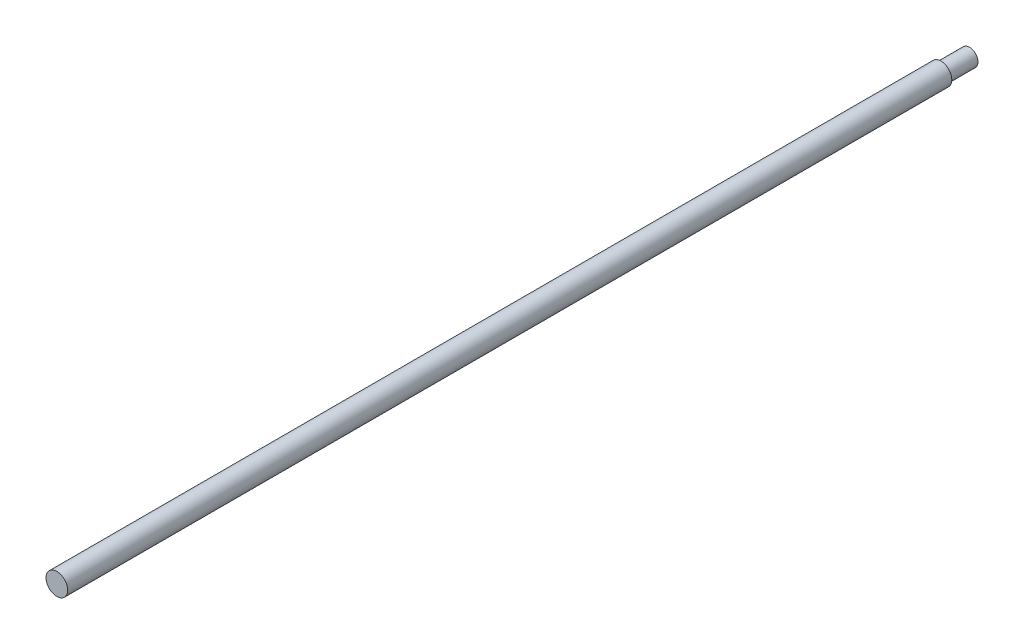
ISO-10303-21;
HEADER;
FILE_DESCRIPTION(('STEP AP214'),'2;1');
FILE_NAME('part.step','',(''),(''),'','','');
FILE_SCHEMA(('AUTOMOTIVE_DESIGN { 1 0 10303 214 1 1 1 1 }'));
ENDSEC;
DATA;
#1=APPLICATION_CONTEXT('core data for automotive mechanical design processes');
#2=APPLICATION_PROTOCOL_DEFINITION('international standard','automotive_design',2000,#1);
#3=PRODUCT_CONTEXT('',#1,'mechanical');
#4=PRODUCT('Part','Part','',(#3));
#5=PRODUCT_RELATED_PRODUCT_CATEGORY('part','',(#4));
#6=PRODUCT_DEFINITION_FORMATION('','',#4);
#7=PRODUCT_DEFINITION_CONTEXT('part definition',#1,'design');
#8=PRODUCT_DEFINITION('design','',#6,#7);
#9=PRODUCT_DEFINITION_SHAPE('','',#8);
#10=(LENGTH_UNIT() NAMED_UNIT(*) SI_UNIT(.MILLI.,.METRE.));
#11=(NAMED_UNIT(*) PLANE_ANGLE_UNIT() SI_UNIT($,.RADIAN.));
#12=(NAMED_UNIT(*) SI_UNIT($,.STERADIAN.) SOLID_ANGLE_UNIT());
#13=UNCERTAINTY_MEASURE_WITH_UNIT(LENGTH_MEASURE(1.E-05),#10,'distance_accuracy_value','');
#14=(GEOMETRIC_REPRESENTATION_CONTEXT(3) GLOBAL_UNCERTAINTY_ASSIGNED_CONTEXT((#13)) GLOBAL_UNIT_ASSIGNED_CONTEXT((#10,
#11,#12)) REPRESENTATION_CONTEXT('',''));
#15=CARTESIAN_POINT('',(0.,0.,0.));
#16=DIRECTION('',(0.,0.,1.));
#17=DIRECTION('',(1.,0.,0.));
#18=AXIS2_PLACEMENT_3D('',#15,#16,#17);
#19=CARTESIAN_POINT('',(0.,0.,320.));
#20=DIRECTION('',(0.,0.,-1.));
#21=DIRECTION('',(-1.,0.,0.));
#22=AXIS2_PLACEMENT_3D('',#19,#20,#21);
#23=CYLINDRICAL_SURFACE('',#22,3.8);
#24=CARTESIAN_POINT('',(0.,0.,320.));
#25=DIRECTION('',(0.,0.,1.));
#26=DIRECTION('',(1.,0.,0.));
#27=AXIS2_PLACEMENT_3D('',#24,#25,#26);
#28=CIRCLE('',#27,3.8);
#29=CARTESIAN_POINT('',(3.8,0.,320.));
#30=VERTEX_POINT('',#29);
#31=EDGE_CURVE('E11',#30,#30,#28,.T.);
#32=ORIENTED_EDGE('',*,*,#31,.F.);
#33=EDGE_LOOP('',(#32));
#34=FACE_BOUND('',#33,.T.);
#35=CARTESIAN_POINT('',(0.,0.,10.));
#36=DIRECTION('',(0.,0.,-1.));
#37=DIRECTION('',(-1.,0.,0.));
#38=AXIS2_PLACEMENT_3D('',#35,#36,#37);
#39=CIRCLE('',#38,3.8);
#40=CARTESIAN_POINT('',(-3.8,0.,10.));
#41=VERTEX_POINT('',#40);
#42=EDGE_CURVE('E38',#41,#41,#39,.T.);
#43=ORIENTED_EDGE('',*,*,#42,.F.);
#44=EDGE_LOOP('',(#43));
#45=FACE_BOUND('',#44,.T.);
#46=ADVANCED_FACE('F35',(#34,#45),#23,.T.);
#47=CARTESIAN_POINT('',(0.,0.,320.));
#48=DIRECTION('',(0.,0.,1.));
#49=DIRECTION('',(1.,0.,0.));
#50=AXIS2_PLACEMENT_3D('',#47,#48,#49);
#51=PLANE('',#50);
#52=ORIENTED_EDGE('',*,*,#31,.T.);
#53=EDGE_LOOP('',(#52));
#54=FACE_BOUND('',#53,.T.);
#55=ADVANCED_FACE('F59',(#54),#51,.T.);
#56=CARTESIAN_POINT('',(0.,0.,10.));
#57=DIRECTION('',(0.,0.,-1.));
#58=DIRECTION('',(-1.,0.,0.));
#59=AXIS2_PLACEMENT_3D('',#56,#57,#58);
#60=PLANE('',#59);
#61=CARTESIAN_POINT('',(0.,0.,10.));
#62=DIRECTION('',(0.,0.,-1.));
#63=DIRECTION('',(-1.,0.,0.));
#64=AXIS2_PLACEMENT_3D('',#61,#62,#63);
#65=CIRCLE('',#64,3.);
#66=CARTESIAN_POINT('',(-3.,0.,10.));
#67=VERTEX_POINT('',#66);
#68=EDGE_CURVE('E45',#67,#67,#65,.T.);
#69=ORIENTED_EDGE('',*,*,#68,.F.);
#70=EDGE_LOOP('',(#69));
#71=FACE_BOUND('',#70,.T.);
#72=ORIENTED_EDGE('',*,*,#42,.T.);
#73=EDGE_LOOP('',(#72));
#74=FACE_BOUND('',#73,.T.);
#75=ADVANCED_FACE('F56',(#71,#74),#60,.T.);
#76=CARTESIAN_POINT('',(0.,0.,10.));
#77=DIRECTION('',(0.,0.,-1.));
#78=DIRECTION('',(-1.,0.,0.));
#79=AXIS2_PLACEMENT_3D('',#76,#77,#78);
#80=CYLINDRICAL_SURFACE('',#79,3.);
#81=ORIENTED_EDGE('',*,*,#68,.T.);
#82=EDGE_LOOP('',(#81));
#83=FACE_BOUND('',#82,.T.);
#84=CARTESIAN_POINT('',(0.,0.,0.));
#85=DIRECTION('',(0.,0.,-1.));
#86=DIRECTION('',(-1.,0.,0.));
#87=AXIS2_PLACEMENT_3D('',#84,#85,#86);
#88=CIRCLE('',#87,3.);
#89=CARTESIAN_POINT('',(-3.,0.,0.));
#90=VERTEX_POINT('',#89);
#91=EDGE_CURVE('E47',#90,#90,#88,.T.);
#92=ORIENTED_EDGE('',*,*,#91,.F.);
#93=EDGE_LOOP('',(#92));
#94=FACE_BOUND('',#93,.T.);
#95=ADVANCED_FACE('F53',(#83,#94),#80,.T.);
#96=CARTESIAN_POINT('',(0.,0.,0.));
#97=DIRECTION('',(0.,0.,1.));
#98=DIRECTION('',(1.,0.,0.));
#99=AXIS2_PLACEMENT_3D('',#96,#97,#98);
#100=PLANE('',#99);
#101=ORIENTED_EDGE('',*,*,#91,.T.);
#102=EDGE_LOOP('',(#101));
#103=FACE_BOUND('',#102,.T.);
#104=ADVANCED_FACE('F72',(#103),#100,.F.);
#105=CLOSED_SHELL('',(#46,#55,#75,#95,#104));
#106=MANIFOLD_SOLID_BREP('B2',#105);
#107=ADVANCED_BREP_SHAPE_REPRESENTATION('',(#18,#106),#14);
#108=SHAPE_DEFINITION_REPRESENTATION(#9,#107);
ENDSEC;
END-ISO-10303-21;
